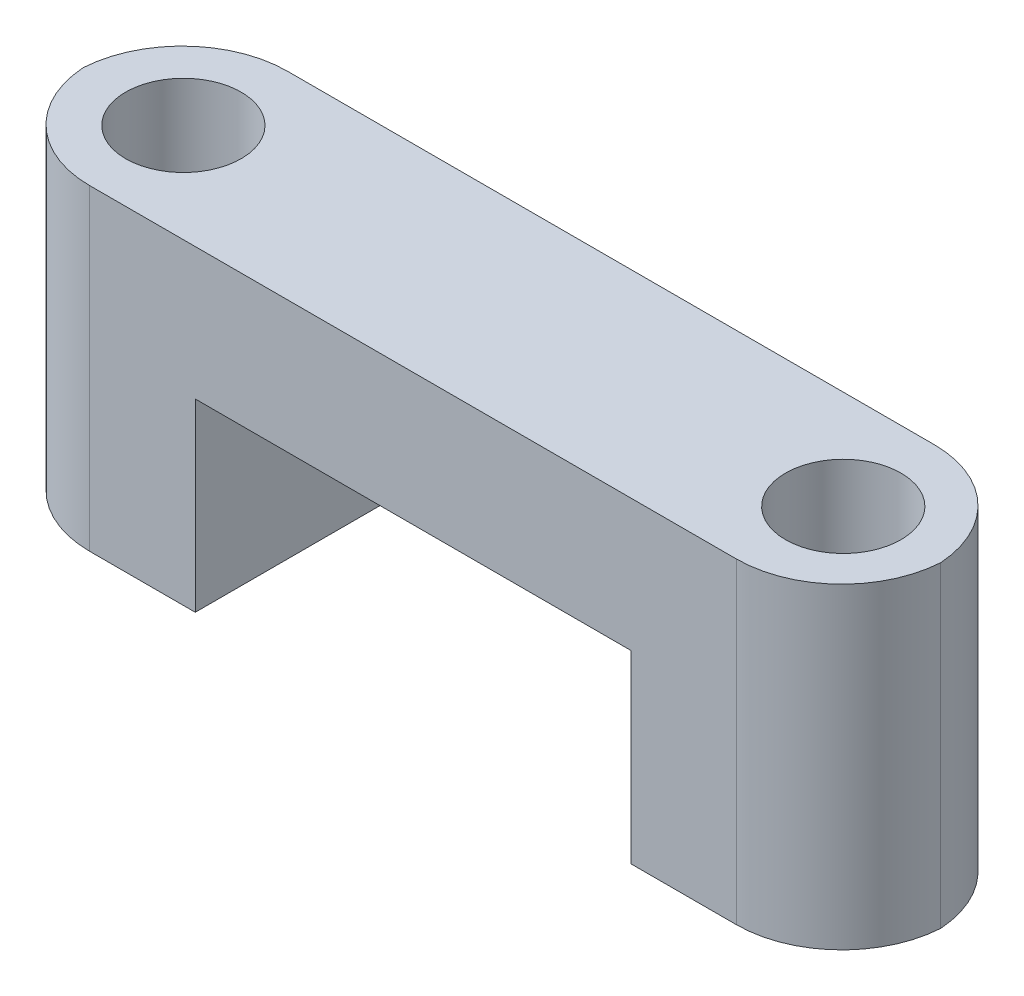
ISO-10303-21;
HEADER;
FILE_DESCRIPTION(('STEP AP214'),'2;1');
FILE_NAME('part.step','',(''),(''),'','','');
FILE_SCHEMA(('AUTOMOTIVE_DESIGN { 1 0 10303 214 1 1 1 1 }'));
ENDSEC;
DATA;
#1=APPLICATION_CONTEXT('core data for automotive mechanical design processes');
#2=APPLICATION_PROTOCOL_DEFINITION('international standard','automotive_design',2000,#1);
#3=PRODUCT_CONTEXT('',#1,'mechanical');
#4=PRODUCT('Part','Part','',(#3));
#5=PRODUCT_RELATED_PRODUCT_CATEGORY('part','',(#4));
#6=PRODUCT_DEFINITION_FORMATION('','',#4);
#7=PRODUCT_DEFINITION_CONTEXT('part definition',#1,'design');
#8=PRODUCT_DEFINITION('design','',#6,#7);
#9=PRODUCT_DEFINITION_SHAPE('','',#8);
#10=(LENGTH_UNIT() NAMED_UNIT(*) SI_UNIT(.MILLI.,.METRE.));
#11=(NAMED_UNIT(*) PLANE_ANGLE_UNIT() SI_UNIT($,.RADIAN.));
#12=(NAMED_UNIT(*) SI_UNIT($,.STERADIAN.) SOLID_ANGLE_UNIT());
#13=UNCERTAINTY_MEASURE_WITH_UNIT(LENGTH_MEASURE(1.E-05),#10,'distance_accuracy_value','');
#14=(GEOMETRIC_REPRESENTATION_CONTEXT(3) GLOBAL_UNCERTAINTY_ASSIGNED_CONTEXT((#13)) GLOBAL_UNIT_ASSIGNED_CONTEXT((#10,
#11,#12)) REPRESENTATION_CONTEXT('',''));
#15=CARTESIAN_POINT('',(0.,0.,0.));
#16=DIRECTION('',(0.,0.,1.));
#17=DIRECTION('',(1.,0.,0.));
#18=AXIS2_PLACEMENT_3D('',#15,#16,#17);
#19=CARTESIAN_POINT('',(0.,0.,0.));
#20=DIRECTION('',(0.,-1.,0.));
#21=DIRECTION('',(0.,0.,-1.));
#22=AXIS2_PLACEMENT_3D('',#19,#20,#21);
#23=PLANE('',#22);
#24=DIRECTION('',(-1.,0.,0.));
#25=VECTOR('',#24,1.);
#26=CARTESIAN_POINT('',(-20.6375,0.,-4.7625));
#27=LINE('',#26,#25);
#28=CARTESIAN_POINT('',(10.4775,0.,-4.7625));
#29=VERTEX_POINT('',#28);
#30=CARTESIAN_POINT('',(-10.4775,0.,-4.7625));
#31=VERTEX_POINT('',#30);
#32=EDGE_CURVE('E176',#29,#31,#27,.T.);
#33=ORIENTED_EDGE('',*,*,#32,.F.);
#34=DIRECTION('',(0.,0.,-1.));
#35=VECTOR('',#34,1.);
#36=CARTESIAN_POINT('',(10.4775,0.,4.7625));
#37=LINE('',#36,#35);
#38=CARTESIAN_POINT('',(10.4775,0.,4.7625));
#39=VERTEX_POINT('',#38);
#40=EDGE_CURVE('E129',#39,#29,#37,.T.);
#41=ORIENTED_EDGE('',*,*,#40,.F.);
#42=DIRECTION('',(1.,0.,0.));
#43=VECTOR('',#42,1.);
#44=CARTESIAN_POINT('',(-20.6375,0.,4.7625));
#45=LINE('',#44,#43);
#46=CARTESIAN_POINT('',(-10.4775,0.,4.7625));
#47=VERTEX_POINT('',#46);
#48=EDGE_CURVE('E135',#47,#39,#45,.T.);
#49=ORIENTED_EDGE('',*,*,#48,.F.);
#50=DIRECTION('',(0.,0.,1.));
#51=VECTOR('',#50,1.);
#52=CARTESIAN_POINT('',(-10.4775,0.,4.7625));
#53=LINE('',#52,#51);
#54=EDGE_CURVE('E140',#31,#47,#53,.T.);
#55=ORIENTED_EDGE('',*,*,#54,.F.);
#56=EDGE_LOOP('',(#33,#41,#49,#55));
#57=FACE_BOUND('',#56,.T.);
#58=ADVANCED_FACE('F39',(#57),#23,.T.);
#59=CARTESIAN_POINT('',(-20.6375,6.35,-4.7625));
#60=DIRECTION('',(0.,0.,1.));
#61=DIRECTION('',(1.,0.,0.));
#62=AXIS2_PLACEMENT_3D('',#59,#60,#61);
#63=PLANE('',#62);
#64=DIRECTION('',(-1.,0.,0.));
#65=VECTOR('',#64,1.);
#66=CARTESIAN_POINT('',(-20.6375,6.35,-4.7625));
#67=LINE('',#66,#65);
#68=CARTESIAN_POINT('',(15.5575,6.35,-4.7625));
#69=VERTEX_POINT('',#68);
#70=CARTESIAN_POINT('',(-15.5575,6.35,-4.7625));
#71=VERTEX_POINT('',#70);
#72=EDGE_CURVE('E177',#69,#71,#67,.T.);
#73=ORIENTED_EDGE('',*,*,#72,.F.);
#74=DIRECTION('',(0.,-1.,0.));
#75=VECTOR('',#74,1.);
#76=CARTESIAN_POINT('',(15.5575,6.35,-4.7625));
#77=LINE('',#76,#75);
#78=CARTESIAN_POINT('',(15.5575,-8.89,-4.7625));
#79=VERTEX_POINT('',#78);
#80=EDGE_CURVE('E193',#69,#79,#77,.T.);
#81=ORIENTED_EDGE('',*,*,#80,.T.);
#82=DIRECTION('',(1.,0.,0.));
#83=VECTOR('',#82,1.);
#84=CARTESIAN_POINT('',(20.6375,-8.89,-4.7625));
#85=LINE('',#84,#83);
#86=CARTESIAN_POINT('',(10.4775,-8.89,-4.7625));
#87=VERTEX_POINT('',#86);
#88=EDGE_CURVE('E146',#87,#79,#85,.T.);
#89=ORIENTED_EDGE('',*,*,#88,.F.);
#90=DIRECTION('',(0.,1.,0.));
#91=VECTOR('',#90,1.);
#92=CARTESIAN_POINT('',(10.4775,-8.89,-4.7625));
#93=LINE('',#92,#91);
#94=EDGE_CURVE('E141',#87,#29,#93,.T.);
#95=ORIENTED_EDGE('',*,*,#94,.T.);
#96=ORIENTED_EDGE('',*,*,#32,.T.);
#97=DIRECTION('',(0.,1.,0.));
#98=VECTOR('',#97,1.);
#99=CARTESIAN_POINT('',(-10.4775,-8.89,-4.7625));
#100=LINE('',#99,#98);
#101=CARTESIAN_POINT('',(-10.4775,-8.89,-4.7625));
#102=VERTEX_POINT('',#101);
#103=EDGE_CURVE('E172',#102,#31,#100,.T.);
#104=ORIENTED_EDGE('',*,*,#103,.F.);
#105=DIRECTION('',(1.,0.,0.));
#106=VECTOR('',#105,1.);
#107=CARTESIAN_POINT('',(-20.6375,-8.89,-4.7625));
#108=LINE('',#107,#106);
#109=CARTESIAN_POINT('',(-15.5575,-8.89,-4.7625));
#110=VERTEX_POINT('',#109);
#111=EDGE_CURVE('E157',#110,#102,#108,.T.);
#112=ORIENTED_EDGE('',*,*,#111,.F.);
#113=DIRECTION('',(0.,-1.,0.));
#114=VECTOR('',#113,1.);
#115=CARTESIAN_POINT('',(-15.5575,6.35,-4.7625));
#116=LINE('',#115,#114);
#117=EDGE_CURVE('E185',#110,#71,#116,.F.);
#118=ORIENTED_EDGE('',*,*,#117,.T.);
#119=EDGE_LOOP('',(#73,#81,#89,#95,#96,#104,#112,#118));
#120=FACE_BOUND('',#119,.T.);
#121=ADVANCED_FACE('F247',(#120),#63,.F.);
#122=CARTESIAN_POINT('',(-20.6375,6.35,4.7625));
#123=DIRECTION('',(0.,0.,-1.));
#124=DIRECTION('',(-1.,0.,0.));
#125=AXIS2_PLACEMENT_3D('',#122,#123,#124);
#126=PLANE('',#125);
#127=DIRECTION('',(-1.,0.,0.));
#128=VECTOR('',#127,1.);
#129=CARTESIAN_POINT('',(20.6375,-8.89,4.7625));
#130=LINE('',#129,#128);
#131=CARTESIAN_POINT('',(15.5575,-8.89,4.7625));
#132=VERTEX_POINT('',#131);
#133=CARTESIAN_POINT('',(10.4775,-8.89,4.7625));
#134=VERTEX_POINT('',#133);
#135=EDGE_CURVE('E118',#132,#134,#130,.T.);
#136=ORIENTED_EDGE('',*,*,#135,.F.);
#137=DIRECTION('',(0.,-1.,0.));
#138=VECTOR('',#137,1.);
#139=CARTESIAN_POINT('',(15.5575,6.35,4.7625));
#140=LINE('',#139,#138);
#141=CARTESIAN_POINT('',(15.5575,6.35,4.7625));
#142=VERTEX_POINT('',#141);
#143=EDGE_CURVE('E216',#132,#142,#140,.F.);
#144=ORIENTED_EDGE('',*,*,#143,.T.);
#145=DIRECTION('',(1.,0.,0.));
#146=VECTOR('',#145,1.);
#147=CARTESIAN_POINT('',(-20.6375,6.35,4.7625));
#148=LINE('',#147,#146);
#149=CARTESIAN_POINT('',(-15.5575,6.35,4.7625));
#150=VERTEX_POINT('',#149);
#151=EDGE_CURVE('E181',#150,#142,#148,.T.);
#152=ORIENTED_EDGE('',*,*,#151,.F.);
#153=DIRECTION('',(0.,-1.,0.));
#154=VECTOR('',#153,1.);
#155=CARTESIAN_POINT('',(-15.5575,6.35,4.7625));
#156=LINE('',#155,#154);
#157=CARTESIAN_POINT('',(-15.5575,-8.89,4.7625));
#158=VERTEX_POINT('',#157);
#159=EDGE_CURVE('E63',#150,#158,#156,.T.);
#160=ORIENTED_EDGE('',*,*,#159,.T.);
#161=DIRECTION('',(-1.,0.,0.));
#162=VECTOR('',#161,1.);
#163=CARTESIAN_POINT('',(-20.6375,-8.89,4.7625));
#164=LINE('',#163,#162);
#165=CARTESIAN_POINT('',(-10.4775,-8.89,4.7625));
#166=VERTEX_POINT('',#165);
#167=EDGE_CURVE('E163',#166,#158,#164,.T.);
#168=ORIENTED_EDGE('',*,*,#167,.F.);
#169=DIRECTION('',(0.,1.,0.));
#170=VECTOR('',#169,1.);
#171=CARTESIAN_POINT('',(-10.4775,-8.89,4.7625));
#172=LINE('',#171,#170);
#173=EDGE_CURVE('E166',#166,#47,#172,.T.);
#174=ORIENTED_EDGE('',*,*,#173,.T.);
#175=ORIENTED_EDGE('',*,*,#48,.T.);
#176=DIRECTION('',(0.,1.,0.));
#177=VECTOR('',#176,1.);
#178=CARTESIAN_POINT('',(10.4775,-8.89,4.7625));
#179=LINE('',#178,#177);
#180=EDGE_CURVE('E132',#134,#39,#179,.T.);
#181=ORIENTED_EDGE('',*,*,#180,.F.);
#182=EDGE_LOOP('',(#136,#144,#152,#160,#168,#174,#175,#181));
#183=FACE_BOUND('',#182,.T.);
#184=ADVANCED_FACE('F133',(#183),#126,.F.);
#185=CARTESIAN_POINT('',(0.,6.35,0.));
#186=DIRECTION('',(0.,-1.,0.));
#187=DIRECTION('',(0.,0.,-1.));
#188=AXIS2_PLACEMENT_3D('',#185,#186,#187);
#189=PLANE('',#188);
#190=CARTESIAN_POINT('',(-15.8115,6.35,0.));
#191=DIRECTION('',(0.,1.,0.));
#192=DIRECTION('',(0.,0.,1.));
#193=AXIS2_PLACEMENT_3D('',#190,#191,#192);
#194=CIRCLE('',#193,2.778125);
#195=CARTESIAN_POINT('',(-15.8115,6.35,2.778125));
#196=VERTEX_POINT('',#195);
#197=EDGE_CURVE('E223',#196,#196,#194,.T.);
#198=ORIENTED_EDGE('',*,*,#197,.F.);
#199=EDGE_LOOP('',(#198));
#200=FACE_BOUND('',#199,.T.);
#201=CARTESIAN_POINT('',(15.9385,6.35,0.));
#202=DIRECTION('',(0.,1.,0.));
#203=DIRECTION('',(0.,0.,1.));
#204=AXIS2_PLACEMENT_3D('',#201,#202,#203);
#205=CIRCLE('',#204,2.778125);
#206=CARTESIAN_POINT('',(15.9385,6.35,2.778125));
#207=VERTEX_POINT('',#206);
#208=EDGE_CURVE('E376',#207,#207,#205,.T.);
#209=ORIENTED_EDGE('',*,*,#208,.F.);
#210=EDGE_LOOP('',(#209));
#211=FACE_BOUND('',#210,.T.);
#212=CARTESIAN_POINT('',(15.5575,6.35,-0.317500000000002));
#213=DIRECTION('',(0.,-1.,0.));
#214=DIRECTION('',(0.,0.,-1.));
#215=AXIS2_PLACEMENT_3D('',#212,#213,#214);
#216=CIRCLE('',#215,5.08);
#217=CARTESIAN_POINT('',(20.6275684166981,6.35,0.));
#218=VERTEX_POINT('',#217);
#219=EDGE_CURVE('E208',#142,#218,#216,.F.);
#220=ORIENTED_EDGE('',*,*,#219,.T.);
#221=CARTESIAN_POINT('',(15.5575,6.35,0.317499999999997));
#222=DIRECTION('',(0.,-1.,0.));
#223=DIRECTION('',(0.,0.,-1.));
#224=AXIS2_PLACEMENT_3D('',#221,#222,#223);
#225=CIRCLE('',#224,5.08);
#226=EDGE_CURVE('E211',#218,#69,#225,.F.);
#227=ORIENTED_EDGE('',*,*,#226,.T.);
#228=ORIENTED_EDGE('',*,*,#72,.T.);
#229=CARTESIAN_POINT('',(-15.5575,6.35,0.317499999999997));
#230=DIRECTION('',(0.,-1.,0.));
#231=DIRECTION('',(0.,0.,-1.));
#232=AXIS2_PLACEMENT_3D('',#229,#230,#231);
#233=CIRCLE('',#232,5.08);
#234=CARTESIAN_POINT('',(-20.6275684166981,6.35,0.));
#235=VERTEX_POINT('',#234);
#236=EDGE_CURVE('E205',#71,#235,#233,.F.);
#237=ORIENTED_EDGE('',*,*,#236,.T.);
#238=CARTESIAN_POINT('',(-15.5575,6.35,-0.317500000000002));
#239=DIRECTION('',(0.,-1.,0.));
#240=DIRECTION('',(0.,0.,-1.));
#241=AXIS2_PLACEMENT_3D('',#238,#239,#240);
#242=CIRCLE('',#241,5.08);
#243=EDGE_CURVE('E202',#235,#150,#242,.F.);
#244=ORIENTED_EDGE('',*,*,#243,.T.);
#245=ORIENTED_EDGE('',*,*,#151,.T.);
#246=EDGE_LOOP('',(#220,#227,#228,#237,#244,#245));
#247=FACE_BOUND('',#246,.T.);
#248=ADVANCED_FACE('F240',(#200,#211,#247),#189,.F.);
#249=CARTESIAN_POINT('',(-10.4775,-8.89,4.7625));
#250=DIRECTION('',(-1.,0.,0.));
#251=DIRECTION('',(0.,0.,1.));
#252=AXIS2_PLACEMENT_3D('',#249,#250,#251);
#253=PLANE('',#252);
#254=ORIENTED_EDGE('',*,*,#54,.T.);
#255=ORIENTED_EDGE('',*,*,#173,.F.);
#256=DIRECTION('',(0.,0.,1.));
#257=VECTOR('',#256,1.);
#258=CARTESIAN_POINT('',(-10.4775,-8.89,4.7625));
#259=LINE('',#258,#257);
#260=EDGE_CURVE('E160',#102,#166,#259,.T.);
#261=ORIENTED_EDGE('',*,*,#260,.F.);
#262=ORIENTED_EDGE('',*,*,#103,.T.);
#263=EDGE_LOOP('',(#254,#255,#261,#262));
#264=FACE_BOUND('',#263,.T.);
#265=ADVANCED_FACE('F257',(#264),#253,.F.);
#266=CARTESIAN_POINT('',(0.,-8.89,0.));
#267=DIRECTION('',(0.,-1.,0.));
#268=DIRECTION('',(0.,0.,-1.));
#269=AXIS2_PLACEMENT_3D('',#266,#267,#268);
#270=PLANE('',#269);
#271=CARTESIAN_POINT('',(-15.8115,-8.89,0.));
#272=DIRECTION('',(0.,1.,0.));
#273=DIRECTION('',(0.,0.,1.));
#274=AXIS2_PLACEMENT_3D('',#271,#272,#273);
#275=CIRCLE('',#274,2.778125);
#276=CARTESIAN_POINT('',(-15.8115,-8.89,2.778125));
#277=VERTEX_POINT('',#276);
#278=EDGE_CURVE('E230',#277,#277,#275,.T.);
#279=ORIENTED_EDGE('',*,*,#278,.T.);
#280=EDGE_LOOP('',(#279));
#281=FACE_BOUND('',#280,.T.);
#282=CARTESIAN_POINT('',(-15.5575,-8.89,-0.317500000000002));
#283=DIRECTION('',(0.,-1.,0.));
#284=DIRECTION('',(0.,0.,-1.));
#285=AXIS2_PLACEMENT_3D('',#282,#283,#284);
#286=CIRCLE('',#285,5.08);
#287=CARTESIAN_POINT('',(-20.6275684166981,-8.89,0.));
#288=VERTEX_POINT('',#287);
#289=EDGE_CURVE('E49',#158,#288,#286,.T.);
#290=ORIENTED_EDGE('',*,*,#289,.T.);
#291=CARTESIAN_POINT('',(-15.5575,-8.89,0.317499999999997));
#292=DIRECTION('',(0.,-1.,0.));
#293=DIRECTION('',(0.,0.,-1.));
#294=AXIS2_PLACEMENT_3D('',#291,#292,#293);
#295=CIRCLE('',#294,5.08);
#296=EDGE_CURVE('E11',#288,#110,#295,.T.);
#297=ORIENTED_EDGE('',*,*,#296,.T.);
#298=ORIENTED_EDGE('',*,*,#111,.T.);
#299=ORIENTED_EDGE('',*,*,#260,.T.);
#300=ORIENTED_EDGE('',*,*,#167,.T.);
#301=EDGE_LOOP('',(#290,#297,#298,#299,#300));
#302=FACE_BOUND('',#301,.T.);
#303=ADVANCED_FACE('F258',(#281,#302),#270,.T.);
#304=CARTESIAN_POINT('',(10.4775,-8.89,4.7625));
#305=DIRECTION('',(1.,0.,0.));
#306=DIRECTION('',(0.,0.,-1.));
#307=AXIS2_PLACEMENT_3D('',#304,#305,#306);
#308=PLANE('',#307);
#309=ORIENTED_EDGE('',*,*,#40,.T.);
#310=ORIENTED_EDGE('',*,*,#94,.F.);
#311=DIRECTION('',(0.,0.,-1.));
#312=VECTOR('',#311,1.);
#313=CARTESIAN_POINT('',(10.4775,-8.89,4.7625));
#314=LINE('',#313,#312);
#315=EDGE_CURVE('E123',#134,#87,#314,.T.);
#316=ORIENTED_EDGE('',*,*,#315,.F.);
#317=ORIENTED_EDGE('',*,*,#180,.T.);
#318=EDGE_LOOP('',(#309,#310,#316,#317));
#319=FACE_BOUND('',#318,.T.);
#320=ADVANCED_FACE('F143',(#319),#308,.F.);
#321=CARTESIAN_POINT('',(0.,-8.89,0.));
#322=DIRECTION('',(0.,1.,0.));
#323=DIRECTION('',(0.,0.,1.));
#324=AXIS2_PLACEMENT_3D('',#321,#322,#323);
#325=PLANE('',#324);
#326=CARTESIAN_POINT('',(15.9385,-8.89,0.));
#327=DIRECTION('',(0.,1.,0.));
#328=DIRECTION('',(0.,0.,1.));
#329=AXIS2_PLACEMENT_3D('',#326,#327,#328);
#330=CIRCLE('',#329,2.778125);
#331=CARTESIAN_POINT('',(15.9385,-8.89,2.778125));
#332=VERTEX_POINT('',#331);
#333=EDGE_CURVE('E154',#332,#332,#330,.T.);
#334=ORIENTED_EDGE('',*,*,#333,.T.);
#335=EDGE_LOOP('',(#334));
#336=FACE_BOUND('',#335,.T.);
#337=ORIENTED_EDGE('',*,*,#88,.T.);
#338=CARTESIAN_POINT('',(15.5575,-8.89,0.317499999999997));
#339=DIRECTION('',(0.,1.,0.));
#340=DIRECTION('',(0.,0.,1.));
#341=AXIS2_PLACEMENT_3D('',#338,#339,#340);
#342=CIRCLE('',#341,5.08);
#343=CARTESIAN_POINT('',(20.6275684166981,-8.89,0.));
#344=VERTEX_POINT('',#343);
#345=EDGE_CURVE('E199',#79,#344,#342,.F.);
#346=ORIENTED_EDGE('',*,*,#345,.T.);
#347=CARTESIAN_POINT('',(15.5575,-8.89,-0.317500000000002));
#348=DIRECTION('',(0.,1.,0.));
#349=DIRECTION('',(0.,0.,1.));
#350=AXIS2_PLACEMENT_3D('',#347,#348,#349);
#351=CIRCLE('',#350,5.08);
#352=EDGE_CURVE('E126',#344,#132,#351,.F.);
#353=ORIENTED_EDGE('',*,*,#352,.T.);
#354=ORIENTED_EDGE('',*,*,#135,.T.);
#355=ORIENTED_EDGE('',*,*,#315,.T.);
#356=EDGE_LOOP('',(#337,#346,#353,#354,#355));
#357=FACE_BOUND('',#356,.T.);
#358=ADVANCED_FACE('F121',(#336,#357),#325,.F.);
#359=CARTESIAN_POINT('',(15.9385,6.35,0.));
#360=DIRECTION('',(0.,1.,0.));
#361=DIRECTION('',(0.,0.,1.));
#362=AXIS2_PLACEMENT_3D('',#359,#360,#361);
#363=CYLINDRICAL_SURFACE('',#362,2.778125);
#364=ORIENTED_EDGE('',*,*,#333,.F.);
#365=EDGE_LOOP('',(#364));
#366=FACE_BOUND('',#365,.T.);
#367=ORIENTED_EDGE('',*,*,#208,.T.);
#368=EDGE_LOOP('',(#367));
#369=FACE_BOUND('',#368,.T.);
#370=ADVANCED_FACE('F304',(#366,#369),#363,.F.);
#371=CARTESIAN_POINT('',(-15.8115,6.35,0.));
#372=DIRECTION('',(0.,1.,0.));
#373=DIRECTION('',(0.,0.,1.));
#374=AXIS2_PLACEMENT_3D('',#371,#372,#373);
#375=CYLINDRICAL_SURFACE('',#374,2.778125);
#376=ORIENTED_EDGE('',*,*,#278,.F.);
#377=EDGE_LOOP('',(#376));
#378=FACE_BOUND('',#377,.T.);
#379=ORIENTED_EDGE('',*,*,#197,.T.);
#380=EDGE_LOOP('',(#379));
#381=FACE_BOUND('',#380,.T.);
#382=ADVANCED_FACE('F282',(#378,#381),#375,.F.);
#383=CARTESIAN_POINT('',(15.5575,6.35,-0.317500000000002));
#384=DIRECTION('',(0.,-1.,0.));
#385=DIRECTION('',(0.,0.,-1.));
#386=AXIS2_PLACEMENT_3D('',#383,#384,#385);
#387=CYLINDRICAL_SURFACE('',#386,5.08);
#388=DIRECTION('',(0.,-1.,0.));
#389=VECTOR('',#388,1.);
#390=CARTESIAN_POINT('',(20.6275684166981,-1.27,0.));
#391=LINE('',#390,#389);
#392=EDGE_CURVE('E220',#218,#344,#391,.T.);
#393=ORIENTED_EDGE('',*,*,#392,.F.);
#394=ORIENTED_EDGE('',*,*,#219,.F.);
#395=ORIENTED_EDGE('',*,*,#143,.F.);
#396=ORIENTED_EDGE('',*,*,#352,.F.);
#397=EDGE_LOOP('',(#393,#394,#395,#396));
#398=FACE_BOUND('',#397,.T.);
#399=ADVANCED_FACE('F243',(#398),#387,.T.);
#400=CARTESIAN_POINT('',(15.5575,6.35,0.317499999999997));
#401=DIRECTION('',(0.,-1.,0.));
#402=DIRECTION('',(0.,0.,-1.));
#403=AXIS2_PLACEMENT_3D('',#400,#401,#402);
#404=CYLINDRICAL_SURFACE('',#403,5.08);
#405=ORIENTED_EDGE('',*,*,#226,.F.);
#406=ORIENTED_EDGE('',*,*,#392,.T.);
#407=ORIENTED_EDGE('',*,*,#345,.F.);
#408=ORIENTED_EDGE('',*,*,#80,.F.);
#409=EDGE_LOOP('',(#405,#406,#407,#408));
#410=FACE_BOUND('',#409,.T.);
#411=ADVANCED_FACE('F249',(#410),#404,.T.);
#412=CARTESIAN_POINT('',(-15.5575,6.35,-0.317500000000002));
#413=DIRECTION('',(0.,-1.,0.));
#414=DIRECTION('',(0.,0.,-1.));
#415=AXIS2_PLACEMENT_3D('',#412,#413,#414);
#416=CYLINDRICAL_SURFACE('',#415,5.08);
#417=ORIENTED_EDGE('',*,*,#159,.F.);
#418=ORIENTED_EDGE('',*,*,#243,.F.);
#419=DIRECTION('',(0.,-1.,0.));
#420=VECTOR('',#419,1.);
#421=CARTESIAN_POINT('',(-20.6275684166981,-1.27,0.));
#422=LINE('',#421,#420);
#423=EDGE_CURVE('E43',#288,#235,#422,.F.);
#424=ORIENTED_EDGE('',*,*,#423,.F.);
#425=ORIENTED_EDGE('',*,*,#289,.F.);
#426=EDGE_LOOP('',(#417,#418,#424,#425));
#427=FACE_BOUND('',#426,.T.);
#428=ADVANCED_FACE('F41',(#427),#416,.T.);
#429=CARTESIAN_POINT('',(-15.5575,6.35,0.317499999999997));
#430=DIRECTION('',(0.,-1.,0.));
#431=DIRECTION('',(0.,0.,-1.));
#432=AXIS2_PLACEMENT_3D('',#429,#430,#431);
#433=CYLINDRICAL_SURFACE('',#432,5.08);
#434=ORIENTED_EDGE('',*,*,#236,.F.);
#435=ORIENTED_EDGE('',*,*,#117,.F.);
#436=ORIENTED_EDGE('',*,*,#296,.F.);
#437=ORIENTED_EDGE('',*,*,#423,.T.);
#438=EDGE_LOOP('',(#434,#435,#436,#437));
#439=FACE_BOUND('',#438,.T.);
#440=ADVANCED_FACE('F235',(#439),#433,.T.);
#441=CLOSED_SHELL('',(#58,#121,#184,#248,#265,#303,#320,#358,#370,#382,#399,#411,#428,#440));
#442=MANIFOLD_SOLID_BREP('B2',#441);
#443=ADVANCED_BREP_SHAPE_REPRESENTATION('',(#18,#442),#14);
#444=SHAPE_DEFINITION_REPRESENTATION(#9,#443);
ENDSEC;
END-ISO-10303-21;
